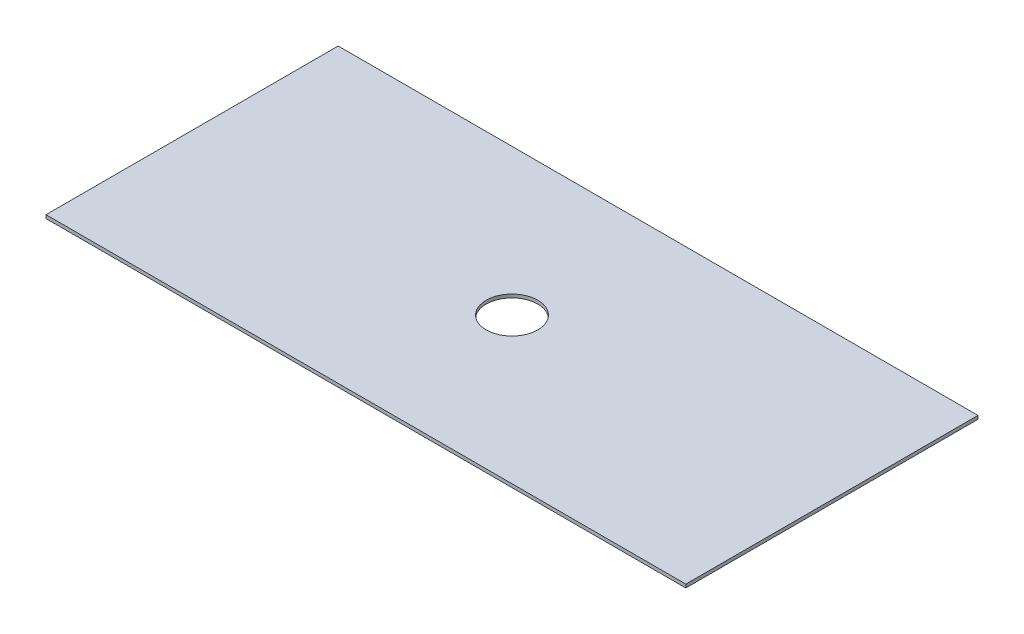
ISO-10303-21;
HEADER;
FILE_DESCRIPTION(('STEP AP214'),'2;1');
FILE_NAME('part.step','',(''),(''),'','','');
FILE_SCHEMA(('AUTOMOTIVE_DESIGN { 1 0 10303 214 1 1 1 1 }'));
ENDSEC;
DATA;
#1=APPLICATION_CONTEXT('core data for automotive mechanical design processes');
#2=APPLICATION_PROTOCOL_DEFINITION('international standard','automotive_design',2000,#1);
#3=PRODUCT_CONTEXT('',#1,'mechanical');
#4=PRODUCT('Part','Part','',(#3));
#5=PRODUCT_RELATED_PRODUCT_CATEGORY('part','',(#4));
#6=PRODUCT_DEFINITION_FORMATION('','',#4);
#7=PRODUCT_DEFINITION_CONTEXT('part definition',#1,'design');
#8=PRODUCT_DEFINITION('design','',#6,#7);
#9=PRODUCT_DEFINITION_SHAPE('','',#8);
#10=(LENGTH_UNIT() NAMED_UNIT(*) SI_UNIT(.MILLI.,.METRE.));
#11=(NAMED_UNIT(*) PLANE_ANGLE_UNIT() SI_UNIT($,.RADIAN.));
#12=(NAMED_UNIT(*) SI_UNIT($,.STERADIAN.) SOLID_ANGLE_UNIT());
#13=UNCERTAINTY_MEASURE_WITH_UNIT(LENGTH_MEASURE(1.E-05),#10,'distance_accuracy_value','');
#14=(GEOMETRIC_REPRESENTATION_CONTEXT(3) GLOBAL_UNCERTAINTY_ASSIGNED_CONTEXT((#13)) GLOBAL_UNIT_ASSIGNED_CONTEXT((#10,
#11,#12)) REPRESENTATION_CONTEXT('',''));
#15=CARTESIAN_POINT('',(0.,0.,0.));
#16=DIRECTION('',(0.,0.,1.));
#17=DIRECTION('',(1.,0.,0.));
#18=AXIS2_PLACEMENT_3D('',#15,#16,#17);
#19=CARTESIAN_POINT('',(-473.,5.,216.));
#20=DIRECTION('',(1.,0.,0.));
#21=DIRECTION('',(0.,0.,-1.));
#22=AXIS2_PLACEMENT_3D('',#19,#20,#21);
#23=PLANE('',#22);
#24=DIRECTION('',(0.,0.,1.));
#25=VECTOR('',#24,1.);
#26=CARTESIAN_POINT('',(-473.,0.,216.));
#27=LINE('',#26,#25);
#28=CARTESIAN_POINT('',(-473.,0.,-216.));
#29=VERTEX_POINT('',#28);
#30=CARTESIAN_POINT('',(-473.,0.,216.));
#31=VERTEX_POINT('',#30);
#32=EDGE_CURVE('E96',#29,#31,#27,.T.);
#33=ORIENTED_EDGE('',*,*,#32,.T.);
#34=DIRECTION('',(0.,-1.,0.));
#35=VECTOR('',#34,1.);
#36=CARTESIAN_POINT('',(-473.,5.,216.));
#37=LINE('',#36,#35);
#38=CARTESIAN_POINT('',(-473.,5.,216.));
#39=VERTEX_POINT('',#38);
#40=EDGE_CURVE('E11',#39,#31,#37,.T.);
#41=ORIENTED_EDGE('',*,*,#40,.F.);
#42=DIRECTION('',(0.,0.,1.));
#43=VECTOR('',#42,1.);
#44=CARTESIAN_POINT('',(-473.,5.,216.));
#45=LINE('',#44,#43);
#46=CARTESIAN_POINT('',(-473.,5.,-216.));
#47=VERTEX_POINT('',#46);
#48=EDGE_CURVE('E84',#47,#39,#45,.T.);
#49=ORIENTED_EDGE('',*,*,#48,.F.);
#50=DIRECTION('',(0.,-1.,0.));
#51=VECTOR('',#50,1.);
#52=CARTESIAN_POINT('',(-473.,5.,-216.));
#53=LINE('',#52,#51);
#54=EDGE_CURVE('E92',#47,#29,#53,.T.);
#55=ORIENTED_EDGE('',*,*,#54,.T.);
#56=EDGE_LOOP('',(#33,#41,#49,#55));
#57=FACE_BOUND('',#56,.T.);
#58=ADVANCED_FACE('F33',(#57),#23,.F.);
#59=CARTESIAN_POINT('',(473.,5.,216.));
#60=DIRECTION('',(0.,0.,-1.));
#61=DIRECTION('',(-1.,0.,0.));
#62=AXIS2_PLACEMENT_3D('',#59,#60,#61);
#63=PLANE('',#62);
#64=DIRECTION('',(1.,0.,0.));
#65=VECTOR('',#64,1.);
#66=CARTESIAN_POINT('',(473.,0.,216.));
#67=LINE('',#66,#65);
#68=CARTESIAN_POINT('',(473.,0.,216.));
#69=VERTEX_POINT('',#68);
#70=EDGE_CURVE('E88',#31,#69,#67,.T.);
#71=ORIENTED_EDGE('',*,*,#70,.T.);
#72=DIRECTION('',(0.,-1.,0.));
#73=VECTOR('',#72,1.);
#74=CARTESIAN_POINT('',(473.,5.,216.));
#75=LINE('',#74,#73);
#76=CARTESIAN_POINT('',(473.,5.,216.));
#77=VERTEX_POINT('',#76);
#78=EDGE_CURVE('E41',#77,#69,#75,.T.);
#79=ORIENTED_EDGE('',*,*,#78,.F.);
#80=DIRECTION('',(1.,0.,0.));
#81=VECTOR('',#80,1.);
#82=CARTESIAN_POINT('',(473.,5.,216.));
#83=LINE('',#82,#81);
#84=EDGE_CURVE('E79',#39,#77,#83,.T.);
#85=ORIENTED_EDGE('',*,*,#84,.F.);
#86=ORIENTED_EDGE('',*,*,#40,.T.);
#87=EDGE_LOOP('',(#71,#79,#85,#86));
#88=FACE_BOUND('',#87,.T.);
#89=ADVANCED_FACE('F87',(#88),#63,.F.);
#90=CARTESIAN_POINT('',(473.,5.,216.));
#91=DIRECTION('',(-1.,0.,0.));
#92=DIRECTION('',(0.,0.,1.));
#93=AXIS2_PLACEMENT_3D('',#90,#91,#92);
#94=PLANE('',#93);
#95=DIRECTION('',(0.,0.,-1.));
#96=VECTOR('',#95,1.);
#97=CARTESIAN_POINT('',(473.,0.,216.));
#98=LINE('',#97,#96);
#99=CARTESIAN_POINT('',(473.,0.,-216.));
#100=VERTEX_POINT('',#99);
#101=EDGE_CURVE('E66',#69,#100,#98,.T.);
#102=ORIENTED_EDGE('',*,*,#101,.T.);
#103=DIRECTION('',(0.,-1.,0.));
#104=VECTOR('',#103,1.);
#105=CARTESIAN_POINT('',(473.,5.,-216.));
#106=LINE('',#105,#104);
#107=CARTESIAN_POINT('',(473.,5.,-216.));
#108=VERTEX_POINT('',#107);
#109=EDGE_CURVE('E89',#108,#100,#106,.T.);
#110=ORIENTED_EDGE('',*,*,#109,.F.);
#111=DIRECTION('',(0.,0.,-1.));
#112=VECTOR('',#111,1.);
#113=CARTESIAN_POINT('',(473.,5.,216.));
#114=LINE('',#113,#112);
#115=EDGE_CURVE('E82',#77,#108,#114,.T.);
#116=ORIENTED_EDGE('',*,*,#115,.F.);
#117=ORIENTED_EDGE('',*,*,#78,.T.);
#118=EDGE_LOOP('',(#102,#110,#116,#117));
#119=FACE_BOUND('',#118,.T.);
#120=ADVANCED_FACE('F90',(#119),#94,.F.);
#121=CARTESIAN_POINT('',(473.,5.,-216.));
#122=DIRECTION('',(0.,0.,1.));
#123=DIRECTION('',(1.,0.,0.));
#124=AXIS2_PLACEMENT_3D('',#121,#122,#123);
#125=PLANE('',#124);
#126=DIRECTION('',(-1.,0.,0.));
#127=VECTOR('',#126,1.);
#128=CARTESIAN_POINT('',(473.,0.,-216.));
#129=LINE('',#128,#127);
#130=EDGE_CURVE('E72',#100,#29,#129,.T.);
#131=ORIENTED_EDGE('',*,*,#130,.T.);
#132=ORIENTED_EDGE('',*,*,#54,.F.);
#133=DIRECTION('',(-1.,0.,0.));
#134=VECTOR('',#133,1.);
#135=CARTESIAN_POINT('',(473.,5.,-216.));
#136=LINE('',#135,#134);
#137=EDGE_CURVE('E49',#108,#47,#136,.T.);
#138=ORIENTED_EDGE('',*,*,#137,.F.);
#139=ORIENTED_EDGE('',*,*,#109,.T.);
#140=EDGE_LOOP('',(#131,#132,#138,#139));
#141=FACE_BOUND('',#140,.T.);
#142=ADVANCED_FACE('F104',(#141),#125,.F.);
#143=CARTESIAN_POINT('',(0.,5.,0.));
#144=DIRECTION('',(0.,1.,0.));
#145=DIRECTION('',(0.,0.,1.));
#146=AXIS2_PLACEMENT_3D('',#143,#144,#145);
#147=PLANE('',#146);
#148=CARTESIAN_POINT('',(0.,5.,0.));
#149=DIRECTION('',(0.,-1.,0.));
#150=DIRECTION('',(0.,0.,-1.));
#151=AXIS2_PLACEMENT_3D('',#148,#149,#150);
#152=CIRCLE('',#151,38.1);
#153=CARTESIAN_POINT('',(0.,5.,-38.1));
#154=VERTEX_POINT('',#153);
#155=EDGE_CURVE('E99',#154,#154,#152,.T.);
#156=ORIENTED_EDGE('',*,*,#155,.T.);
#157=EDGE_LOOP('',(#156));
#158=FACE_BOUND('',#157,.T.);
#159=ORIENTED_EDGE('',*,*,#48,.T.);
#160=ORIENTED_EDGE('',*,*,#84,.T.);
#161=ORIENTED_EDGE('',*,*,#115,.T.);
#162=ORIENTED_EDGE('',*,*,#137,.T.);
#163=EDGE_LOOP('',(#159,#160,#161,#162));
#164=FACE_BOUND('',#163,.T.);
#165=ADVANCED_FACE('F80',(#158,#164),#147,.T.);
#166=CARTESIAN_POINT('',(0.,0.,0.));
#167=DIRECTION('',(0.,1.,0.));
#168=DIRECTION('',(0.,0.,1.));
#169=AXIS2_PLACEMENT_3D('',#166,#167,#168);
#170=PLANE('',#169);
#171=CARTESIAN_POINT('',(0.,0.,0.));
#172=DIRECTION('',(0.,-1.,0.));
#173=DIRECTION('',(0.,0.,-1.));
#174=AXIS2_PLACEMENT_3D('',#171,#172,#173);
#175=CIRCLE('',#174,38.1);
#176=CARTESIAN_POINT('',(0.,0.,-38.1));
#177=VERTEX_POINT('',#176);
#178=EDGE_CURVE('E110',#177,#177,#175,.T.);
#179=ORIENTED_EDGE('',*,*,#178,.F.);
#180=EDGE_LOOP('',(#179));
#181=FACE_BOUND('',#180,.T.);
#182=ORIENTED_EDGE('',*,*,#32,.F.);
#183=ORIENTED_EDGE('',*,*,#130,.F.);
#184=ORIENTED_EDGE('',*,*,#101,.F.);
#185=ORIENTED_EDGE('',*,*,#70,.F.);
#186=EDGE_LOOP('',(#182,#183,#184,#185));
#187=FACE_BOUND('',#186,.T.);
#188=ADVANCED_FACE('F107',(#181,#187),#170,.F.);
#189=CARTESIAN_POINT('',(0.,5.,0.));
#190=DIRECTION('',(0.,-1.,0.));
#191=DIRECTION('',(0.,0.,-1.));
#192=AXIS2_PLACEMENT_3D('',#189,#190,#191);
#193=CYLINDRICAL_SURFACE('',#192,38.1);
#194=ORIENTED_EDGE('',*,*,#155,.F.);
#195=EDGE_LOOP('',(#194));
#196=FACE_BOUND('',#195,.T.);
#197=ORIENTED_EDGE('',*,*,#178,.T.);
#198=EDGE_LOOP('',(#197));
#199=FACE_BOUND('',#198,.T.);
#200=ADVANCED_FACE('F117',(#196,#199),#193,.F.);
#201=CLOSED_SHELL('',(#58,#89,#120,#142,#165,#188,#200));
#202=MANIFOLD_SOLID_BREP('B2',#201);
#203=ADVANCED_BREP_SHAPE_REPRESENTATION('',(#18,#202),#14);
#204=SHAPE_DEFINITION_REPRESENTATION(#9,#203);
ENDSEC;
END-ISO-10303-21;
